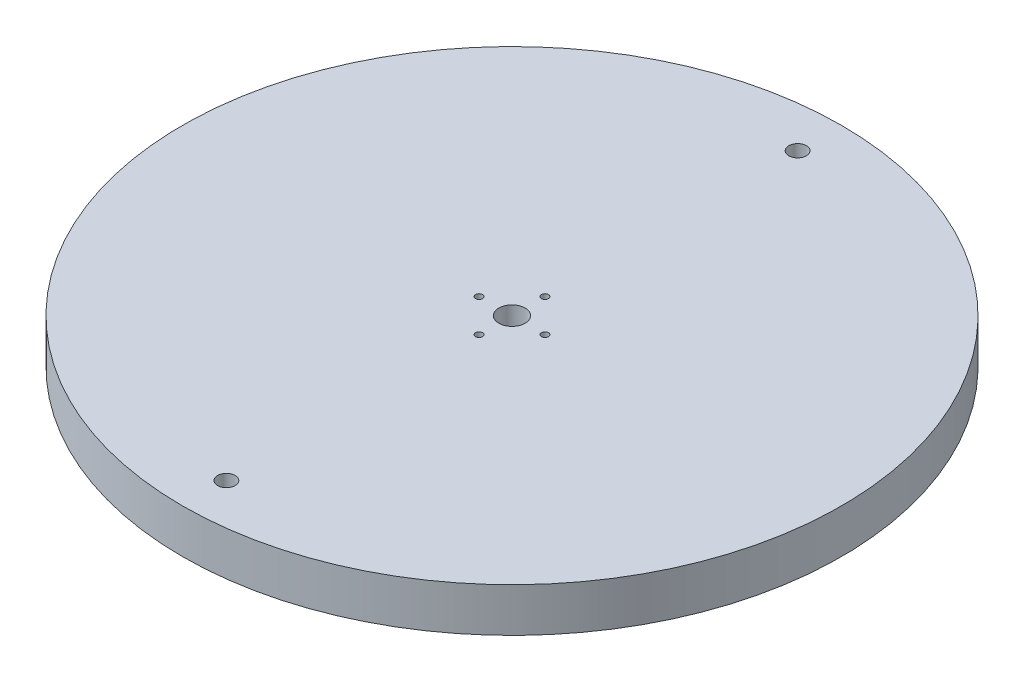
ISO-10303-21;
HEADER;
FILE_DESCRIPTION(('STEP AP214'),'2;1');
FILE_NAME('part.step','',(''),(''),'','','');
FILE_SCHEMA(('AUTOMOTIVE_DESIGN { 1 0 10303 214 1 1 1 1 }'));
ENDSEC;
DATA;
#1=APPLICATION_CONTEXT('core data for automotive mechanical design processes');
#2=APPLICATION_PROTOCOL_DEFINITION('international standard','automotive_design',2000,#1);
#3=PRODUCT_CONTEXT('',#1,'mechanical');
#4=PRODUCT('Part','Part','',(#3));
#5=PRODUCT_RELATED_PRODUCT_CATEGORY('part','',(#4));
#6=PRODUCT_DEFINITION_FORMATION('','',#4);
#7=PRODUCT_DEFINITION_CONTEXT('part definition',#1,'design');
#8=PRODUCT_DEFINITION('design','',#6,#7);
#9=PRODUCT_DEFINITION_SHAPE('','',#8);
#10=(LENGTH_UNIT() NAMED_UNIT(*) SI_UNIT(.MILLI.,.METRE.));
#11=(NAMED_UNIT(*) PLANE_ANGLE_UNIT() SI_UNIT($,.RADIAN.));
#12=(NAMED_UNIT(*) SI_UNIT($,.STERADIAN.) SOLID_ANGLE_UNIT());
#13=UNCERTAINTY_MEASURE_WITH_UNIT(LENGTH_MEASURE(1.E-05),#10,'distance_accuracy_value','');
#14=(GEOMETRIC_REPRESENTATION_CONTEXT(3) GLOBAL_UNCERTAINTY_ASSIGNED_CONTEXT((#13)) GLOBAL_UNIT_ASSIGNED_CONTEXT((#10,
#11,#12)) REPRESENTATION_CONTEXT('',''));
#15=CARTESIAN_POINT('',(0.,0.,0.));
#16=DIRECTION('',(0.,0.,1.));
#17=DIRECTION('',(1.,0.,0.));
#18=AXIS2_PLACEMENT_3D('',#15,#16,#17);
#19=CARTESIAN_POINT('',(0.,10.,0.));
#20=DIRECTION('',(0.,-1.,0.));
#21=DIRECTION('',(0.,0.,-1.));
#22=AXIS2_PLACEMENT_3D('',#19,#20,#21);
#23=CYLINDRICAL_SURFACE('',#22,75.);
#24=CARTESIAN_POINT('',(0.,10.,0.));
#25=DIRECTION('',(0.,1.,0.));
#26=DIRECTION('',(0.,0.,1.));
#27=AXIS2_PLACEMENT_3D('',#24,#25,#26);
#28=CIRCLE('',#27,75.);
#29=CARTESIAN_POINT('',(0.,10.,75.));
#30=VERTEX_POINT('',#29);
#31=EDGE_CURVE('E51',#30,#30,#28,.T.);
#32=ORIENTED_EDGE('',*,*,#31,.F.);
#33=EDGE_LOOP('',(#32));
#34=FACE_BOUND('',#33,.T.);
#35=CARTESIAN_POINT('',(0.,0.,0.));
#36=DIRECTION('',(0.,1.,0.));
#37=DIRECTION('',(0.,0.,1.));
#38=AXIS2_PLACEMENT_3D('',#35,#36,#37);
#39=CIRCLE('',#38,75.);
#40=CARTESIAN_POINT('',(0.,0.,75.));
#41=VERTEX_POINT('',#40);
#42=EDGE_CURVE('E77',#41,#41,#39,.T.);
#43=ORIENTED_EDGE('',*,*,#42,.T.);
#44=EDGE_LOOP('',(#43));
#45=FACE_BOUND('',#44,.T.);
#46=ADVANCED_FACE('F43',(#34,#45),#23,.T.);
#47=CARTESIAN_POINT('',(0.,10.,-7.5));
#48=DIRECTION('',(0.,-1.,0.));
#49=DIRECTION('',(0.,0.,-1.));
#50=AXIS2_PLACEMENT_3D('',#47,#48,#49);
#51=CYLINDRICAL_SURFACE('',#50,0.8);
#52=CARTESIAN_POINT('',(0.,10.,-7.5));
#53=DIRECTION('',(0.,1.,0.));
#54=DIRECTION('',(0.,0.,1.));
#55=AXIS2_PLACEMENT_3D('',#52,#53,#54);
#56=CIRCLE('',#55,0.8);
#57=CARTESIAN_POINT('',(0.,10.,-6.7));
#58=VERTEX_POINT('',#57);
#59=EDGE_CURVE('E56',#58,#58,#56,.T.);
#60=ORIENTED_EDGE('',*,*,#59,.T.);
#61=EDGE_LOOP('',(#60));
#62=FACE_BOUND('',#61,.T.);
#63=CARTESIAN_POINT('',(0.,0.,-7.5));
#64=DIRECTION('',(0.,1.,0.));
#65=DIRECTION('',(0.,0.,1.));
#66=AXIS2_PLACEMENT_3D('',#63,#64,#65);
#67=CIRCLE('',#66,0.8);
#68=CARTESIAN_POINT('',(0.,0.,-6.7));
#69=VERTEX_POINT('',#68);
#70=EDGE_CURVE('E75',#69,#69,#67,.T.);
#71=ORIENTED_EDGE('',*,*,#70,.F.);
#72=EDGE_LOOP('',(#71));
#73=FACE_BOUND('',#72,.T.);
#74=ADVANCED_FACE('F104',(#62,#73),#51,.F.);
#75=CARTESIAN_POINT('',(0.,10.,-65.));
#76=DIRECTION('',(0.,-1.,0.));
#77=DIRECTION('',(0.,0.,-1.));
#78=AXIS2_PLACEMENT_3D('',#75,#76,#77);
#79=CYLINDRICAL_SURFACE('',#78,2.);
#80=CARTESIAN_POINT('',(0.,10.,-65.));
#81=DIRECTION('',(0.,1.,0.));
#82=DIRECTION('',(0.,0.,1.));
#83=AXIS2_PLACEMENT_3D('',#80,#81,#82);
#84=CIRCLE('',#83,2.);
#85=CARTESIAN_POINT('',(0.,10.,-63.));
#86=VERTEX_POINT('',#85);
#87=EDGE_CURVE('E99',#86,#86,#84,.T.);
#88=ORIENTED_EDGE('',*,*,#87,.T.);
#89=EDGE_LOOP('',(#88));
#90=FACE_BOUND('',#89,.T.);
#91=CARTESIAN_POINT('',(0.,0.,-65.));
#92=DIRECTION('',(0.,1.,0.));
#93=DIRECTION('',(0.,0.,1.));
#94=AXIS2_PLACEMENT_3D('',#91,#92,#93);
#95=CIRCLE('',#94,2.);
#96=CARTESIAN_POINT('',(0.,0.,-63.));
#97=VERTEX_POINT('',#96);
#98=EDGE_CURVE('E72',#97,#97,#95,.T.);
#99=ORIENTED_EDGE('',*,*,#98,.F.);
#100=EDGE_LOOP('',(#99));
#101=FACE_BOUND('',#100,.T.);
#102=ADVANCED_FACE('F122',(#90,#101),#79,.F.);
#103=CARTESIAN_POINT('',(-4.53892574049608E-13,10.,65.));
#104=DIRECTION('',(0.,-1.,0.));
#105=DIRECTION('',(0.,0.,-1.));
#106=AXIS2_PLACEMENT_3D('',#103,#104,#105);
#107=CYLINDRICAL_SURFACE('',#106,2.);
#108=CARTESIAN_POINT('',(-4.53892574049608E-13,10.,65.));
#109=DIRECTION('',(0.,1.,0.));
#110=DIRECTION('',(0.,0.,1.));
#111=AXIS2_PLACEMENT_3D('',#108,#109,#110);
#112=CIRCLE('',#111,2.);
#113=CARTESIAN_POINT('',(-4.53892574049608E-13,10.,67.));
#114=VERTEX_POINT('',#113);
#115=EDGE_CURVE('E96',#114,#114,#112,.T.);
#116=ORIENTED_EDGE('',*,*,#115,.T.);
#117=EDGE_LOOP('',(#116));
#118=FACE_BOUND('',#117,.T.);
#119=CARTESIAN_POINT('',(-4.53892574049608E-13,0.,65.));
#120=DIRECTION('',(0.,1.,0.));
#121=DIRECTION('',(0.,0.,1.));
#122=AXIS2_PLACEMENT_3D('',#119,#120,#121);
#123=CIRCLE('',#122,2.);
#124=CARTESIAN_POINT('',(-4.53892574049608E-13,0.,67.));
#125=VERTEX_POINT('',#124);
#126=EDGE_CURVE('E69',#125,#125,#123,.T.);
#127=ORIENTED_EDGE('',*,*,#126,.F.);
#128=EDGE_LOOP('',(#127));
#129=FACE_BOUND('',#128,.T.);
#130=ADVANCED_FACE('F129',(#118,#129),#107,.F.);
#131=CARTESIAN_POINT('',(-7.5,10.,0.));
#132=DIRECTION('',(0.,-1.,0.));
#133=DIRECTION('',(0.,0.,-1.));
#134=AXIS2_PLACEMENT_3D('',#131,#132,#133);
#135=CYLINDRICAL_SURFACE('',#134,0.8);
#136=CARTESIAN_POINT('',(-7.5,10.,0.));
#137=DIRECTION('',(0.,1.,0.));
#138=DIRECTION('',(0.,0.,1.));
#139=AXIS2_PLACEMENT_3D('',#136,#137,#138);
#140=CIRCLE('',#139,0.8);
#141=CARTESIAN_POINT('',(-7.5,10.,0.799999999999974));
#142=VERTEX_POINT('',#141);
#143=EDGE_CURVE('E91',#142,#142,#140,.T.);
#144=ORIENTED_EDGE('',*,*,#143,.T.);
#145=EDGE_LOOP('',(#144));
#146=FACE_BOUND('',#145,.T.);
#147=CARTESIAN_POINT('',(-7.5,0.,0.));
#148=DIRECTION('',(0.,1.,0.));
#149=DIRECTION('',(0.,0.,1.));
#150=AXIS2_PLACEMENT_3D('',#147,#148,#149);
#151=CIRCLE('',#150,0.8);
#152=CARTESIAN_POINT('',(-7.5,0.,0.799999999999974));
#153=VERTEX_POINT('',#152);
#154=EDGE_CURVE('E66',#153,#153,#151,.T.);
#155=ORIENTED_EDGE('',*,*,#154,.F.);
#156=EDGE_LOOP('',(#155));
#157=FACE_BOUND('',#156,.T.);
#158=ADVANCED_FACE('F133',(#146,#157),#135,.F.);
#159=CARTESIAN_POINT('',(0.,10.,7.5));
#160=DIRECTION('',(0.,-1.,0.));
#161=DIRECTION('',(0.,0.,-1.));
#162=AXIS2_PLACEMENT_3D('',#159,#160,#161);
#163=CYLINDRICAL_SURFACE('',#162,0.8);
#164=CARTESIAN_POINT('',(0.,10.,7.5));
#165=DIRECTION('',(0.,1.,0.));
#166=DIRECTION('',(0.,0.,1.));
#167=AXIS2_PLACEMENT_3D('',#164,#165,#166);
#168=CIRCLE('',#167,0.8);
#169=CARTESIAN_POINT('',(0.,10.,8.3));
#170=VERTEX_POINT('',#169);
#171=EDGE_CURVE('E86',#170,#170,#168,.T.);
#172=ORIENTED_EDGE('',*,*,#171,.T.);
#173=EDGE_LOOP('',(#172));
#174=FACE_BOUND('',#173,.T.);
#175=CARTESIAN_POINT('',(0.,0.,7.5));
#176=DIRECTION('',(0.,1.,0.));
#177=DIRECTION('',(0.,0.,1.));
#178=AXIS2_PLACEMENT_3D('',#175,#176,#177);
#179=CIRCLE('',#178,0.8);
#180=CARTESIAN_POINT('',(0.,0.,8.3));
#181=VERTEX_POINT('',#180);
#182=EDGE_CURVE('E63',#181,#181,#179,.T.);
#183=ORIENTED_EDGE('',*,*,#182,.F.);
#184=EDGE_LOOP('',(#183));
#185=FACE_BOUND('',#184,.T.);
#186=ADVANCED_FACE('F136',(#174,#185),#163,.F.);
#187=CARTESIAN_POINT('',(7.5,10.,0.));
#188=DIRECTION('',(0.,-1.,0.));
#189=DIRECTION('',(0.,0.,-1.));
#190=AXIS2_PLACEMENT_3D('',#187,#188,#189);
#191=CYLINDRICAL_SURFACE('',#190,0.8);
#192=CARTESIAN_POINT('',(7.5,10.,0.));
#193=DIRECTION('',(0.,1.,0.));
#194=DIRECTION('',(0.,0.,1.));
#195=AXIS2_PLACEMENT_3D('',#192,#193,#194);
#196=CIRCLE('',#195,0.8);
#197=CARTESIAN_POINT('',(7.5,10.,0.800000000000079));
#198=VERTEX_POINT('',#197);
#199=EDGE_CURVE('E82',#198,#198,#196,.T.);
#200=ORIENTED_EDGE('',*,*,#199,.T.);
#201=EDGE_LOOP('',(#200));
#202=FACE_BOUND('',#201,.T.);
#203=CARTESIAN_POINT('',(7.5,0.,0.));
#204=DIRECTION('',(0.,1.,0.));
#205=DIRECTION('',(0.,0.,1.));
#206=AXIS2_PLACEMENT_3D('',#203,#204,#205);
#207=CIRCLE('',#206,0.8);
#208=CARTESIAN_POINT('',(7.5,0.,0.800000000000079));
#209=VERTEX_POINT('',#208);
#210=EDGE_CURVE('E60',#209,#209,#207,.T.);
#211=ORIENTED_EDGE('',*,*,#210,.F.);
#212=EDGE_LOOP('',(#211));
#213=FACE_BOUND('',#212,.T.);
#214=ADVANCED_FACE('F45',(#202,#213),#191,.F.);
#215=CARTESIAN_POINT('',(0.,10.,0.));
#216=DIRECTION('',(0.,-1.,0.));
#217=DIRECTION('',(0.,0.,-1.));
#218=AXIS2_PLACEMENT_3D('',#215,#216,#217);
#219=CYLINDRICAL_SURFACE('',#218,3.);
#220=CARTESIAN_POINT('',(0.,10.,0.));
#221=DIRECTION('',(0.,1.,0.));
#222=DIRECTION('',(0.,0.,1.));
#223=AXIS2_PLACEMENT_3D('',#220,#221,#222);
#224=CIRCLE('',#223,3.);
#225=CARTESIAN_POINT('',(0.,10.,3.));
#226=VERTEX_POINT('',#225);
#227=EDGE_CURVE('E10',#226,#226,#224,.T.);
#228=ORIENTED_EDGE('',*,*,#227,.T.);
#229=EDGE_LOOP('',(#228));
#230=FACE_BOUND('',#229,.T.);
#231=CARTESIAN_POINT('',(0.,0.,0.));
#232=DIRECTION('',(0.,1.,0.));
#233=DIRECTION('',(0.,0.,1.));
#234=AXIS2_PLACEMENT_3D('',#231,#232,#233);
#235=CIRCLE('',#234,3.);
#236=CARTESIAN_POINT('',(0.,0.,3.));
#237=VERTEX_POINT('',#236);
#238=EDGE_CURVE('E47',#237,#237,#235,.T.);
#239=ORIENTED_EDGE('',*,*,#238,.F.);
#240=EDGE_LOOP('',(#239));
#241=FACE_BOUND('',#240,.T.);
#242=ADVANCED_FACE('F111',(#230,#241),#219,.F.);
#243=CARTESIAN_POINT('',(0.,10.,0.));
#244=DIRECTION('',(0.,1.,0.));
#245=DIRECTION('',(0.,0.,1.));
#246=AXIS2_PLACEMENT_3D('',#243,#244,#245);
#247=PLANE('',#246);
#248=ORIENTED_EDGE('',*,*,#199,.F.);
#249=EDGE_LOOP('',(#248));
#250=FACE_BOUND('',#249,.T.);
#251=ORIENTED_EDGE('',*,*,#171,.F.);
#252=EDGE_LOOP('',(#251));
#253=FACE_BOUND('',#252,.T.);
#254=ORIENTED_EDGE('',*,*,#143,.F.);
#255=EDGE_LOOP('',(#254));
#256=FACE_BOUND('',#255,.T.);
#257=ORIENTED_EDGE('',*,*,#115,.F.);
#258=EDGE_LOOP('',(#257));
#259=FACE_BOUND('',#258,.T.);
#260=ORIENTED_EDGE('',*,*,#87,.F.);
#261=EDGE_LOOP('',(#260));
#262=FACE_BOUND('',#261,.T.);
#263=ORIENTED_EDGE('',*,*,#59,.F.);
#264=EDGE_LOOP('',(#263));
#265=FACE_BOUND('',#264,.T.);
#266=ORIENTED_EDGE('',*,*,#31,.T.);
#267=EDGE_LOOP('',(#266));
#268=FACE_BOUND('',#267,.T.);
#269=ORIENTED_EDGE('',*,*,#227,.F.);
#270=EDGE_LOOP('',(#269));
#271=FACE_BOUND('',#270,.T.);
#272=ADVANCED_FACE('F107',(#250,#253,#256,#259,#262,#265,#268,#271),#247,.T.);
#273=CARTESIAN_POINT('',(0.,0.,0.));
#274=DIRECTION('',(0.,1.,0.));
#275=DIRECTION('',(0.,0.,1.));
#276=AXIS2_PLACEMENT_3D('',#273,#274,#275);
#277=PLANE('',#276);
#278=ORIENTED_EDGE('',*,*,#210,.T.);
#279=EDGE_LOOP('',(#278));
#280=FACE_BOUND('',#279,.T.);
#281=ORIENTED_EDGE('',*,*,#182,.T.);
#282=EDGE_LOOP('',(#281));
#283=FACE_BOUND('',#282,.T.);
#284=ORIENTED_EDGE('',*,*,#154,.T.);
#285=EDGE_LOOP('',(#284));
#286=FACE_BOUND('',#285,.T.);
#287=ORIENTED_EDGE('',*,*,#126,.T.);
#288=EDGE_LOOP('',(#287));
#289=FACE_BOUND('',#288,.T.);
#290=ORIENTED_EDGE('',*,*,#98,.T.);
#291=EDGE_LOOP('',(#290));
#292=FACE_BOUND('',#291,.T.);
#293=ORIENTED_EDGE('',*,*,#70,.T.);
#294=EDGE_LOOP('',(#293));
#295=FACE_BOUND('',#294,.T.);
#296=ORIENTED_EDGE('',*,*,#42,.F.);
#297=EDGE_LOOP('',(#296));
#298=FACE_BOUND('',#297,.T.);
#299=ORIENTED_EDGE('',*,*,#238,.T.);
#300=EDGE_LOOP('',(#299));
#301=FACE_BOUND('',#300,.T.);
#302=ADVANCED_FACE('F110',(#280,#283,#286,#289,#292,#295,#298,#301),#277,.F.);
#303=CLOSED_SHELL('',(#46,#74,#102,#130,#158,#186,#214,#242,#272,#302));
#304=MANIFOLD_SOLID_BREP('B2',#303);
#305=ADVANCED_BREP_SHAPE_REPRESENTATION('',(#18,#304),#14);
#306=SHAPE_DEFINITION_REPRESENTATION(#9,#305);
ENDSEC;
END-ISO-10303-21;
